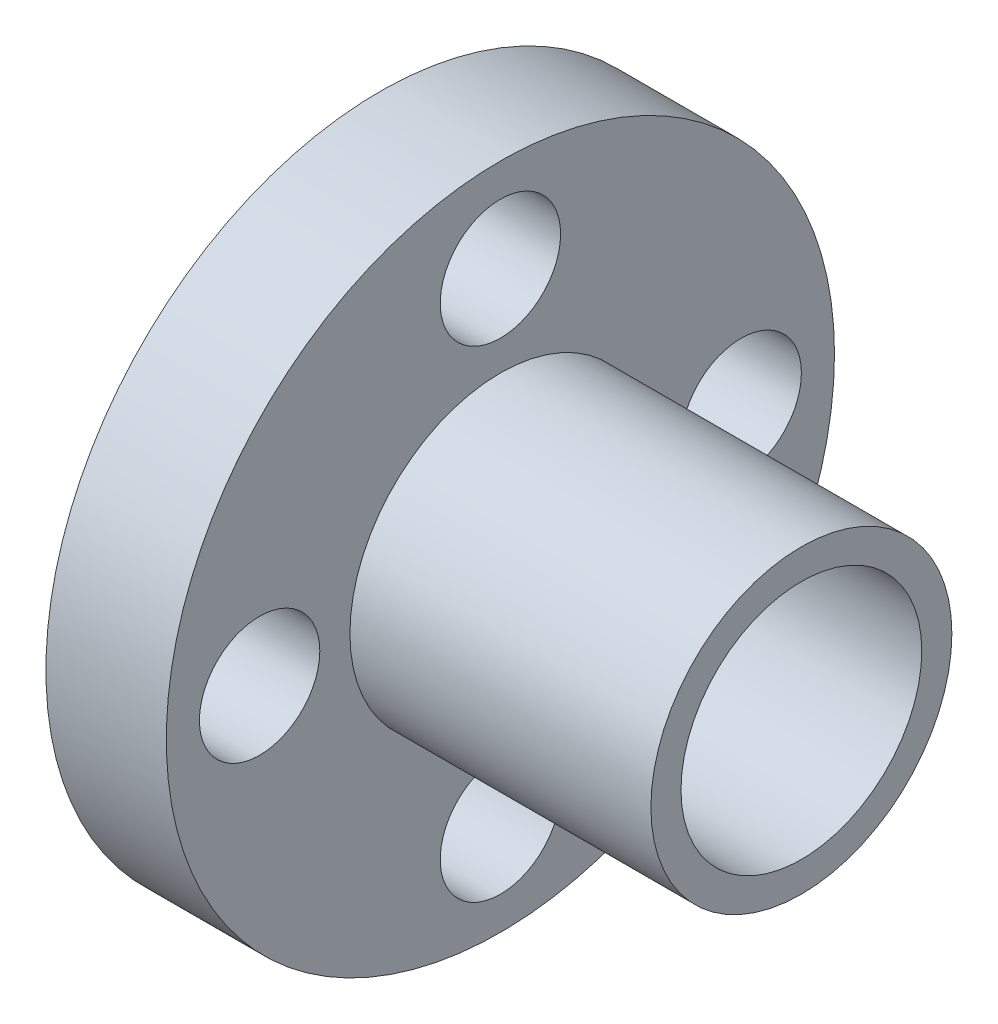
ISO-10303-21;
HEADER;
FILE_DESCRIPTION(('STEP AP214'),'2;1');
FILE_NAME('part.step','',(''),(''),'','','');
FILE_SCHEMA(('AUTOMOTIVE_DESIGN { 1 0 10303 214 1 1 1 1 }'));
ENDSEC;
DATA;
#1=APPLICATION_CONTEXT('core data for automotive mechanical design processes');
#2=APPLICATION_PROTOCOL_DEFINITION('international standard','automotive_design',2000,#1);
#3=PRODUCT_CONTEXT('',#1,'mechanical');
#4=PRODUCT('Part','Part','',(#3));
#5=PRODUCT_RELATED_PRODUCT_CATEGORY('part','',(#4));
#6=PRODUCT_DEFINITION_FORMATION('','',#4);
#7=PRODUCT_DEFINITION_CONTEXT('part definition',#1,'design');
#8=PRODUCT_DEFINITION('design','',#6,#7);
#9=PRODUCT_DEFINITION_SHAPE('','',#8);
#10=(LENGTH_UNIT() NAMED_UNIT(*) SI_UNIT(.MILLI.,.METRE.));
#11=(NAMED_UNIT(*) PLANE_ANGLE_UNIT() SI_UNIT($,.RADIAN.));
#12=(NAMED_UNIT(*) SI_UNIT($,.STERADIAN.) SOLID_ANGLE_UNIT());
#13=UNCERTAINTY_MEASURE_WITH_UNIT(LENGTH_MEASURE(1.E-05),#10,'distance_accuracy_value','');
#14=(GEOMETRIC_REPRESENTATION_CONTEXT(3) GLOBAL_UNCERTAINTY_ASSIGNED_CONTEXT((#13)) GLOBAL_UNIT_ASSIGNED_CONTEXT((#10,
#11,#12)) REPRESENTATION_CONTEXT('',''));
#15=CARTESIAN_POINT('',(0.,0.,0.));
#16=DIRECTION('',(0.,0.,1.));
#17=DIRECTION('',(1.,0.,0.));
#18=AXIS2_PLACEMENT_3D('',#15,#16,#17);
#19=CARTESIAN_POINT('',(4.,0.,0.));
#20=DIRECTION('',(-1.,0.,0.));
#21=DIRECTION('',(0.,0.,1.));
#22=AXIS2_PLACEMENT_3D('',#19,#20,#21);
#23=CYLINDRICAL_SURFACE('',#22,11.1);
#24=CARTESIAN_POINT('',(4.,0.,0.));
#25=DIRECTION('',(1.,0.,0.));
#26=DIRECTION('',(0.,0.,-1.));
#27=AXIS2_PLACEMENT_3D('',#24,#25,#26);
#28=CIRCLE('',#27,11.1);
#29=CARTESIAN_POINT('',(4.,0.,-11.1));
#30=VERTEX_POINT('',#29);
#31=EDGE_CURVE('E44',#30,#30,#28,.T.);
#32=ORIENTED_EDGE('',*,*,#31,.F.);
#33=EDGE_LOOP('',(#32));
#34=FACE_BOUND('',#33,.T.);
#35=CARTESIAN_POINT('',(0.,0.,0.));
#36=DIRECTION('',(1.,0.,0.));
#37=DIRECTION('',(0.,0.,-1.));
#38=AXIS2_PLACEMENT_3D('',#35,#36,#37);
#39=CIRCLE('',#38,11.1);
#40=CARTESIAN_POINT('',(0.,0.,-11.1));
#41=VERTEX_POINT('',#40);
#42=EDGE_CURVE('E52',#41,#41,#39,.T.);
#43=ORIENTED_EDGE('',*,*,#42,.T.);
#44=EDGE_LOOP('',(#43));
#45=FACE_BOUND('',#44,.T.);
#46=ADVANCED_FACE('F32',(#34,#45),#23,.T.);
#47=CARTESIAN_POINT('',(4.,0.,0.));
#48=DIRECTION('',(1.,0.,0.));
#49=DIRECTION('',(0.,0.,-1.));
#50=AXIS2_PLACEMENT_3D('',#47,#48,#49);
#51=PLANE('',#50);
#52=CARTESIAN_POINT('',(4.,8.,0.));
#53=DIRECTION('',(1.,0.,0.));
#54=DIRECTION('',(0.,0.,-1.));
#55=AXIS2_PLACEMENT_3D('',#52,#53,#54);
#56=CIRCLE('',#55,2.);
#57=CARTESIAN_POINT('',(4.,8.,-2.));
#58=VERTEX_POINT('',#57);
#59=EDGE_CURVE('E82',#58,#58,#56,.T.);
#60=ORIENTED_EDGE('',*,*,#59,.F.);
#61=EDGE_LOOP('',(#60));
#62=FACE_BOUND('',#61,.T.);
#63=CARTESIAN_POINT('',(4.,2.26393958003914E-13,-8.00000000000023));
#64=DIRECTION('',(1.,0.,0.));
#65=DIRECTION('',(0.,0.,-1.));
#66=AXIS2_PLACEMENT_3D('',#63,#64,#65);
#67=CIRCLE('',#66,2.00000000000018);
#68=CARTESIAN_POINT('',(4.,2.26393958003914E-13,-10.0000000000004));
#69=VERTEX_POINT('',#68);
#70=EDGE_CURVE('E71',#69,#69,#67,.T.);
#71=ORIENTED_EDGE('',*,*,#70,.F.);
#72=EDGE_LOOP('',(#71));
#73=FACE_BOUND('',#72,.T.);
#74=CARTESIAN_POINT('',(4.,-8.,-4.52787916007828E-13));
#75=DIRECTION('',(1.,0.,0.));
#76=DIRECTION('',(0.,0.,-1.));
#77=AXIS2_PLACEMENT_3D('',#74,#75,#76);
#78=CIRCLE('',#77,2.00000000000049);
#79=CARTESIAN_POINT('',(4.,-8.,-2.00000000000094));
#80=VERTEX_POINT('',#79);
#81=EDGE_CURVE('E68',#80,#80,#78,.T.);
#82=ORIENTED_EDGE('',*,*,#81,.F.);
#83=EDGE_LOOP('',(#82));
#84=FACE_BOUND('',#83,.T.);
#85=CARTESIAN_POINT('',(4.,-2.27373675443232E-13,7.99999999999977));
#86=DIRECTION('',(1.,0.,0.));
#87=DIRECTION('',(0.,0.,-1.));
#88=AXIS2_PLACEMENT_3D('',#85,#86,#87);
#89=CIRCLE('',#88,2.00000000000036);
#90=CARTESIAN_POINT('',(4.,-2.27373675443232E-13,5.99999999999941));
#91=VERTEX_POINT('',#90);
#92=EDGE_CURVE('E65',#91,#91,#89,.T.);
#93=ORIENTED_EDGE('',*,*,#92,.F.);
#94=EDGE_LOOP('',(#93));
#95=FACE_BOUND('',#94,.T.);
#96=CARTESIAN_POINT('',(4.,0.,0.));
#97=DIRECTION('',(1.,0.,0.));
#98=DIRECTION('',(0.,0.,-1.));
#99=AXIS2_PLACEMENT_3D('',#96,#97,#98);
#100=CIRCLE('',#99,5.);
#101=CARTESIAN_POINT('',(4.,0.,-5.));
#102=VERTEX_POINT('',#101);
#103=EDGE_CURVE('E39',#102,#102,#100,.T.);
#104=ORIENTED_EDGE('',*,*,#103,.F.);
#105=EDGE_LOOP('',(#104));
#106=FACE_BOUND('',#105,.T.);
#107=ORIENTED_EDGE('',*,*,#31,.T.);
#108=EDGE_LOOP('',(#107));
#109=FACE_BOUND('',#108,.T.);
#110=ADVANCED_FACE('F107',(#62,#73,#84,#95,#106,#109),#51,.T.);
#111=CARTESIAN_POINT('',(0.,0.,0.));
#112=DIRECTION('',(1.,0.,0.));
#113=DIRECTION('',(0.,0.,-1.));
#114=AXIS2_PLACEMENT_3D('',#111,#112,#113);
#115=PLANE('',#114);
#116=CARTESIAN_POINT('',(0.,8.,0.));
#117=DIRECTION('',(1.,0.,0.));
#118=DIRECTION('',(0.,0.,-1.));
#119=AXIS2_PLACEMENT_3D('',#116,#117,#118);
#120=CIRCLE('',#119,2.);
#121=CARTESIAN_POINT('',(0.,8.,-2.));
#122=VERTEX_POINT('',#121);
#123=EDGE_CURVE('E35',#122,#122,#120,.T.);
#124=ORIENTED_EDGE('',*,*,#123,.T.);
#125=EDGE_LOOP('',(#124));
#126=FACE_BOUND('',#125,.T.);
#127=CARTESIAN_POINT('',(0.,2.26393958003914E-13,-8.00000000000023));
#128=DIRECTION('',(1.,0.,0.));
#129=DIRECTION('',(0.,0.,-1.));
#130=AXIS2_PLACEMENT_3D('',#127,#128,#129);
#131=CIRCLE('',#130,2.00000000000018);
#132=CARTESIAN_POINT('',(0.,2.26393958003914E-13,-10.0000000000004));
#133=VERTEX_POINT('',#132);
#134=EDGE_CURVE('E69',#133,#133,#131,.T.);
#135=ORIENTED_EDGE('',*,*,#134,.T.);
#136=EDGE_LOOP('',(#135));
#137=FACE_BOUND('',#136,.T.);
#138=CARTESIAN_POINT('',(0.,-8.,-4.52787916007828E-13));
#139=DIRECTION('',(1.,0.,0.));
#140=DIRECTION('',(0.,0.,-1.));
#141=AXIS2_PLACEMENT_3D('',#138,#139,#140);
#142=CIRCLE('',#141,2.00000000000049);
#143=CARTESIAN_POINT('',(0.,-8.,-2.00000000000094));
#144=VERTEX_POINT('',#143);
#145=EDGE_CURVE('E66',#144,#144,#142,.T.);
#146=ORIENTED_EDGE('',*,*,#145,.T.);
#147=EDGE_LOOP('',(#146));
#148=FACE_BOUND('',#147,.T.);
#149=CARTESIAN_POINT('',(0.,-2.27373675443232E-13,7.99999999999977));
#150=DIRECTION('',(1.,0.,0.));
#151=DIRECTION('',(0.,0.,-1.));
#152=AXIS2_PLACEMENT_3D('',#149,#150,#151);
#153=CIRCLE('',#152,2.00000000000036);
#154=CARTESIAN_POINT('',(0.,-2.27373675443232E-13,5.99999999999941));
#155=VERTEX_POINT('',#154);
#156=EDGE_CURVE('E62',#155,#155,#153,.T.);
#157=ORIENTED_EDGE('',*,*,#156,.T.);
#158=EDGE_LOOP('',(#157));
#159=FACE_BOUND('',#158,.T.);
#160=CARTESIAN_POINT('',(0.,0.,0.));
#161=DIRECTION('',(-1.,0.,0.));
#162=DIRECTION('',(0.,0.,1.));
#163=AXIS2_PLACEMENT_3D('',#160,#161,#162);
#164=CIRCLE('',#163,5.);
#165=CARTESIAN_POINT('',(0.,0.,5.));
#166=VERTEX_POINT('',#165);
#167=EDGE_CURVE('E10',#166,#166,#164,.T.);
#168=ORIENTED_EDGE('',*,*,#167,.F.);
#169=EDGE_LOOP('',(#168));
#170=FACE_BOUND('',#169,.T.);
#171=ORIENTED_EDGE('',*,*,#42,.F.);
#172=EDGE_LOOP('',(#171));
#173=FACE_BOUND('',#172,.T.);
#174=ADVANCED_FACE('F112',(#126,#137,#148,#159,#170,#173),#115,.F.);
#175=CARTESIAN_POINT('',(14.,0.,0.));
#176=DIRECTION('',(-1.,0.,0.));
#177=DIRECTION('',(0.,0.,1.));
#178=AXIS2_PLACEMENT_3D('',#175,#176,#177);
#179=CYLINDRICAL_SURFACE('',#178,5.);
#180=CARTESIAN_POINT('',(14.,0.,0.));
#181=DIRECTION('',(1.,0.,0.));
#182=DIRECTION('',(0.,0.,-1.));
#183=AXIS2_PLACEMENT_3D('',#180,#181,#182);
#184=CIRCLE('',#183,5.);
#185=CARTESIAN_POINT('',(14.,0.,-5.));
#186=VERTEX_POINT('',#185);
#187=EDGE_CURVE('E50',#186,#186,#184,.T.);
#188=ORIENTED_EDGE('',*,*,#187,.F.);
#189=EDGE_LOOP('',(#188));
#190=FACE_BOUND('',#189,.T.);
#191=ORIENTED_EDGE('',*,*,#103,.T.);
#192=EDGE_LOOP('',(#191));
#193=FACE_BOUND('',#192,.T.);
#194=ADVANCED_FACE('F120',(#190,#193),#179,.T.);
#195=CARTESIAN_POINT('',(14.,0.,0.));
#196=DIRECTION('',(1.,0.,0.));
#197=DIRECTION('',(0.,0.,-1.));
#198=AXIS2_PLACEMENT_3D('',#195,#196,#197);
#199=PLANE('',#198);
#200=CARTESIAN_POINT('',(14.,0.,0.));
#201=DIRECTION('',(-1.,0.,0.));
#202=DIRECTION('',(0.,0.,1.));
#203=AXIS2_PLACEMENT_3D('',#200,#201,#202);
#204=CIRCLE('',#203,4.);
#205=CARTESIAN_POINT('',(14.,0.,4.));
#206=VERTEX_POINT('',#205);
#207=EDGE_CURVE('E61',#206,#206,#204,.T.);
#208=ORIENTED_EDGE('',*,*,#207,.T.);
#209=EDGE_LOOP('',(#208));
#210=FACE_BOUND('',#209,.T.);
#211=ORIENTED_EDGE('',*,*,#187,.T.);
#212=EDGE_LOOP('',(#211));
#213=FACE_BOUND('',#212,.T.);
#214=ADVANCED_FACE('F87',(#210,#213),#199,.T.);
#215=CARTESIAN_POINT('',(-1.5,0.,0.));
#216=DIRECTION('',(1.,0.,0.));
#217=DIRECTION('',(0.,0.,-1.));
#218=AXIS2_PLACEMENT_3D('',#215,#216,#217);
#219=CYLINDRICAL_SURFACE('',#218,5.);
#220=CARTESIAN_POINT('',(-1.5,0.,0.));
#221=DIRECTION('',(-1.,0.,0.));
#222=DIRECTION('',(0.,0.,1.));
#223=AXIS2_PLACEMENT_3D('',#220,#221,#222);
#224=CIRCLE('',#223,5.);
#225=CARTESIAN_POINT('',(-1.5,0.,5.));
#226=VERTEX_POINT('',#225);
#227=EDGE_CURVE('E48',#226,#226,#224,.T.);
#228=ORIENTED_EDGE('',*,*,#227,.F.);
#229=EDGE_LOOP('',(#228));
#230=FACE_BOUND('',#229,.T.);
#231=ORIENTED_EDGE('',*,*,#167,.T.);
#232=EDGE_LOOP('',(#231));
#233=FACE_BOUND('',#232,.T.);
#234=ADVANCED_FACE('F103',(#230,#233),#219,.T.);
#235=CARTESIAN_POINT('',(-1.5,0.,0.));
#236=DIRECTION('',(-1.,0.,0.));
#237=DIRECTION('',(0.,0.,1.));
#238=AXIS2_PLACEMENT_3D('',#235,#236,#237);
#239=PLANE('',#238);
#240=CARTESIAN_POINT('',(-1.5,0.,0.));
#241=DIRECTION('',(-1.,0.,0.));
#242=DIRECTION('',(0.,0.,1.));
#243=AXIS2_PLACEMENT_3D('',#240,#241,#242);
#244=CIRCLE('',#243,4.);
#245=CARTESIAN_POINT('',(-1.5,0.,4.));
#246=VERTEX_POINT('',#245);
#247=EDGE_CURVE('E58',#246,#246,#244,.T.);
#248=ORIENTED_EDGE('',*,*,#247,.F.);
#249=EDGE_LOOP('',(#248));
#250=FACE_BOUND('',#249,.T.);
#251=ORIENTED_EDGE('',*,*,#227,.T.);
#252=EDGE_LOOP('',(#251));
#253=FACE_BOUND('',#252,.T.);
#254=ADVANCED_FACE('F93',(#250,#253),#239,.T.);
#255=CARTESIAN_POINT('',(14.,0.,0.));
#256=DIRECTION('',(-1.,0.,0.));
#257=DIRECTION('',(0.,0.,1.));
#258=AXIS2_PLACEMENT_3D('',#255,#256,#257);
#259=CYLINDRICAL_SURFACE('',#258,4.);
#260=ORIENTED_EDGE('',*,*,#247,.T.);
#261=EDGE_LOOP('',(#260));
#262=FACE_BOUND('',#261,.T.);
#263=ORIENTED_EDGE('',*,*,#207,.F.);
#264=EDGE_LOOP('',(#263));
#265=FACE_BOUND('',#264,.T.);
#266=ADVANCED_FACE('F90',(#262,#265),#259,.F.);
#267=CARTESIAN_POINT('',(-1.5,-2.27373675443232E-13,7.99999999999977));
#268=DIRECTION('',(1.,0.,0.));
#269=DIRECTION('',(0.,0.,-1.));
#270=AXIS2_PLACEMENT_3D('',#267,#268,#269);
#271=CYLINDRICAL_SURFACE('',#270,2.00000000000036);
#272=ORIENTED_EDGE('',*,*,#92,.T.);
#273=EDGE_LOOP('',(#272));
#274=FACE_BOUND('',#273,.T.);
#275=ORIENTED_EDGE('',*,*,#156,.F.);
#276=EDGE_LOOP('',(#275));
#277=FACE_BOUND('',#276,.T.);
#278=ADVANCED_FACE('F92',(#274,#277),#271,.F.);
#279=CARTESIAN_POINT('',(-1.5,-8.,-4.52787916007828E-13));
#280=DIRECTION('',(1.,0.,0.));
#281=DIRECTION('',(0.,0.,-1.));
#282=AXIS2_PLACEMENT_3D('',#279,#280,#281);
#283=CYLINDRICAL_SURFACE('',#282,2.00000000000049);
#284=ORIENTED_EDGE('',*,*,#81,.T.);
#285=EDGE_LOOP('',(#284));
#286=FACE_BOUND('',#285,.T.);
#287=ORIENTED_EDGE('',*,*,#145,.F.);
#288=EDGE_LOOP('',(#287));
#289=FACE_BOUND('',#288,.T.);
#290=ADVANCED_FACE('F100',(#286,#289),#283,.F.);
#291=CARTESIAN_POINT('',(-1.5,2.26393958003914E-13,-8.00000000000023));
#292=DIRECTION('',(1.,0.,0.));
#293=DIRECTION('',(0.,0.,-1.));
#294=AXIS2_PLACEMENT_3D('',#291,#292,#293);
#295=CYLINDRICAL_SURFACE('',#294,2.00000000000018);
#296=ORIENTED_EDGE('',*,*,#70,.T.);
#297=EDGE_LOOP('',(#296));
#298=FACE_BOUND('',#297,.T.);
#299=ORIENTED_EDGE('',*,*,#134,.F.);
#300=EDGE_LOOP('',(#299));
#301=FACE_BOUND('',#300,.T.);
#302=ADVANCED_FACE('F178',(#298,#301),#295,.F.);
#303=CARTESIAN_POINT('',(-1.5,8.,0.));
#304=DIRECTION('',(1.,0.,0.));
#305=DIRECTION('',(0.,0.,-1.));
#306=AXIS2_PLACEMENT_3D('',#303,#304,#305);
#307=CYLINDRICAL_SURFACE('',#306,2.);
#308=ORIENTED_EDGE('',*,*,#59,.T.);
#309=EDGE_LOOP('',(#308));
#310=FACE_BOUND('',#309,.T.);
#311=ORIENTED_EDGE('',*,*,#123,.F.);
#312=EDGE_LOOP('',(#311));
#313=FACE_BOUND('',#312,.T.);
#314=ADVANCED_FACE('F187',(#310,#313),#307,.F.);
#315=CLOSED_SHELL('',(#46,#110,#174,#194,#214,#234,#254,#266,#278,#290,#302,#314));
#316=MANIFOLD_SOLID_BREP('B2',#315);
#317=ADVANCED_BREP_SHAPE_REPRESENTATION('',(#18,#316),#14);
#318=SHAPE_DEFINITION_REPRESENTATION(#9,#317);
ENDSEC;
END-ISO-10303-21;
